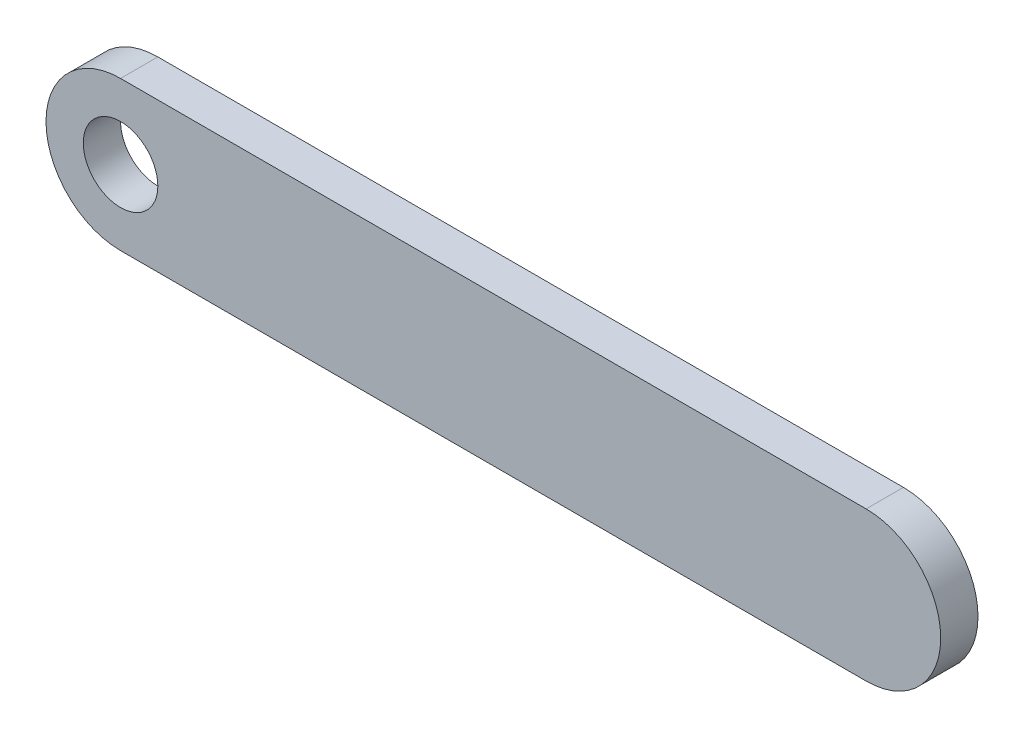
ISO-10303-21;
HEADER;
FILE_DESCRIPTION(('STEP AP214'),'2;1');
FILE_NAME('part.step','',(''),(''),'','','');
FILE_SCHEMA(('AUTOMOTIVE_DESIGN { 1 0 10303 214 1 1 1 1 }'));
ENDSEC;
DATA;
#1=APPLICATION_CONTEXT('core data for automotive mechanical design processes');
#2=APPLICATION_PROTOCOL_DEFINITION('international standard','automotive_design',2000,#1);
#3=PRODUCT_CONTEXT('',#1,'mechanical');
#4=PRODUCT('Part','Part','',(#3));
#5=PRODUCT_RELATED_PRODUCT_CATEGORY('part','',(#4));
#6=PRODUCT_DEFINITION_FORMATION('','',#4);
#7=PRODUCT_DEFINITION_CONTEXT('part definition',#1,'design');
#8=PRODUCT_DEFINITION('design','',#6,#7);
#9=PRODUCT_DEFINITION_SHAPE('','',#8);
#10=(LENGTH_UNIT() NAMED_UNIT(*) SI_UNIT(.MILLI.,.METRE.));
#11=(NAMED_UNIT(*) PLANE_ANGLE_UNIT() SI_UNIT($,.RADIAN.));
#12=(NAMED_UNIT(*) SI_UNIT($,.STERADIAN.) SOLID_ANGLE_UNIT());
#13=UNCERTAINTY_MEASURE_WITH_UNIT(LENGTH_MEASURE(1.E-05),#10,'distance_accuracy_value','');
#14=(GEOMETRIC_REPRESENTATION_CONTEXT(3) GLOBAL_UNCERTAINTY_ASSIGNED_CONTEXT((#13)) GLOBAL_UNIT_ASSIGNED_CONTEXT((#10,
#11,#12)) REPRESENTATION_CONTEXT('',''));
#15=CARTESIAN_POINT('',(0.,0.,0.));
#16=DIRECTION('',(0.,0.,1.));
#17=DIRECTION('',(1.,0.,0.));
#18=AXIS2_PLACEMENT_3D('',#15,#16,#17);
#19=CARTESIAN_POINT('',(0.,0.,5.));
#20=DIRECTION('',(0.,0.,1.));
#21=DIRECTION('',(1.,0.,0.));
#22=AXIS2_PLACEMENT_3D('',#19,#20,#21);
#23=PLANE('',#22);
#24=CARTESIAN_POINT('',(0.,0.,5.));
#25=DIRECTION('',(0.,0.,1.));
#26=DIRECTION('',(1.,0.,0.));
#27=AXIS2_PLACEMENT_3D('',#24,#25,#26);
#28=CIRCLE('',#27,10.);
#29=CARTESIAN_POINT('',(0.,10.,5.));
#30=VERTEX_POINT('',#29);
#31=CARTESIAN_POINT('',(0.,-10.,5.));
#32=VERTEX_POINT('',#31);
#33=EDGE_CURVE('E85',#30,#32,#28,.T.);
#34=ORIENTED_EDGE('',*,*,#33,.T.);
#35=DIRECTION('',(1.,0.,0.));
#36=VECTOR('',#35,1.);
#37=CARTESIAN_POINT('',(0.,-10.,5.));
#38=LINE('',#37,#36);
#39=CARTESIAN_POINT('',(100.,-10.,5.));
#40=VERTEX_POINT('',#39);
#41=EDGE_CURVE('E80',#32,#40,#38,.T.);
#42=ORIENTED_EDGE('',*,*,#41,.T.);
#43=CARTESIAN_POINT('',(100.,0.,5.));
#44=DIRECTION('',(0.,0.,1.));
#45=DIRECTION('',(1.,0.,0.));
#46=AXIS2_PLACEMENT_3D('',#43,#44,#45);
#47=CIRCLE('',#46,10.);
#48=CARTESIAN_POINT('',(100.,10.,5.));
#49=VERTEX_POINT('',#48);
#50=EDGE_CURVE('E83',#40,#49,#47,.T.);
#51=ORIENTED_EDGE('',*,*,#50,.T.);
#52=DIRECTION('',(-1.,0.,0.));
#53=VECTOR('',#52,1.);
#54=CARTESIAN_POINT('',(0.,10.,5.));
#55=LINE('',#54,#53);
#56=EDGE_CURVE('E50',#49,#30,#55,.T.);
#57=ORIENTED_EDGE('',*,*,#56,.T.);
#58=EDGE_LOOP('',(#34,#42,#51,#57));
#59=FACE_BOUND('',#58,.T.);
#60=CARTESIAN_POINT('',(0.,0.,5.));
#61=DIRECTION('',(0.,0.,1.));
#62=DIRECTION('',(1.,0.,0.));
#63=AXIS2_PLACEMENT_3D('',#60,#61,#62);
#64=CIRCLE('',#63,5.);
#65=CARTESIAN_POINT('',(5.,0.,5.));
#66=VERTEX_POINT('',#65);
#67=EDGE_CURVE('E100',#66,#66,#64,.T.);
#68=ORIENTED_EDGE('',*,*,#67,.F.);
#69=EDGE_LOOP('',(#68));
#70=FACE_BOUND('',#69,.T.);
#71=ADVANCED_FACE('F33',(#59,#70),#23,.T.);
#72=CARTESIAN_POINT('',(0.,0.,0.));
#73=DIRECTION('',(0.,0.,1.));
#74=DIRECTION('',(1.,0.,0.));
#75=AXIS2_PLACEMENT_3D('',#72,#73,#74);
#76=PLANE('',#75);
#77=CARTESIAN_POINT('',(0.,0.,0.));
#78=DIRECTION('',(0.,0.,1.));
#79=DIRECTION('',(1.,0.,0.));
#80=AXIS2_PLACEMENT_3D('',#77,#78,#79);
#81=CIRCLE('',#80,10.);
#82=CARTESIAN_POINT('',(0.,10.,0.));
#83=VERTEX_POINT('',#82);
#84=CARTESIAN_POINT('',(0.,-10.,0.));
#85=VERTEX_POINT('',#84);
#86=EDGE_CURVE('E97',#83,#85,#81,.T.);
#87=ORIENTED_EDGE('',*,*,#86,.F.);
#88=DIRECTION('',(-1.,0.,0.));
#89=VECTOR('',#88,1.);
#90=CARTESIAN_POINT('',(0.,10.,0.));
#91=LINE('',#90,#89);
#92=CARTESIAN_POINT('',(100.,10.,0.));
#93=VERTEX_POINT('',#92);
#94=EDGE_CURVE('E73',#93,#83,#91,.T.);
#95=ORIENTED_EDGE('',*,*,#94,.F.);
#96=CARTESIAN_POINT('',(100.,0.,0.));
#97=DIRECTION('',(0.,0.,1.));
#98=DIRECTION('',(1.,0.,0.));
#99=AXIS2_PLACEMENT_3D('',#96,#97,#98);
#100=CIRCLE('',#99,10.);
#101=CARTESIAN_POINT('',(100.,-10.,0.));
#102=VERTEX_POINT('',#101);
#103=EDGE_CURVE('E67',#102,#93,#100,.T.);
#104=ORIENTED_EDGE('',*,*,#103,.F.);
#105=DIRECTION('',(1.,0.,0.));
#106=VECTOR('',#105,1.);
#107=CARTESIAN_POINT('',(0.,-10.,0.));
#108=LINE('',#107,#106);
#109=EDGE_CURVE('E89',#85,#102,#108,.T.);
#110=ORIENTED_EDGE('',*,*,#109,.F.);
#111=EDGE_LOOP('',(#87,#95,#104,#110));
#112=FACE_BOUND('',#111,.T.);
#113=CARTESIAN_POINT('',(0.,0.,0.));
#114=DIRECTION('',(0.,0.,1.));
#115=DIRECTION('',(1.,0.,0.));
#116=AXIS2_PLACEMENT_3D('',#113,#114,#115);
#117=CIRCLE('',#116,5.);
#118=CARTESIAN_POINT('',(5.,0.,0.));
#119=VERTEX_POINT('',#118);
#120=EDGE_CURVE('E112',#119,#119,#117,.T.);
#121=ORIENTED_EDGE('',*,*,#120,.T.);
#122=EDGE_LOOP('',(#121));
#123=FACE_BOUND('',#122,.T.);
#124=ADVANCED_FACE('F108',(#112,#123),#76,.F.);
#125=CARTESIAN_POINT('',(0.,0.,5.));
#126=DIRECTION('',(0.,0.,-1.));
#127=DIRECTION('',(-1.,0.,0.));
#128=AXIS2_PLACEMENT_3D('',#125,#126,#127);
#129=CYLINDRICAL_SURFACE('',#128,10.);
#130=ORIENTED_EDGE('',*,*,#86,.T.);
#131=DIRECTION('',(0.,0.,-1.));
#132=VECTOR('',#131,1.);
#133=CARTESIAN_POINT('',(0.,-10.,5.));
#134=LINE('',#133,#132);
#135=EDGE_CURVE('E11',#32,#85,#134,.T.);
#136=ORIENTED_EDGE('',*,*,#135,.F.);
#137=ORIENTED_EDGE('',*,*,#33,.F.);
#138=DIRECTION('',(0.,0.,-1.));
#139=VECTOR('',#138,1.);
#140=CARTESIAN_POINT('',(0.,10.,5.));
#141=LINE('',#140,#139);
#142=EDGE_CURVE('E93',#30,#83,#141,.T.);
#143=ORIENTED_EDGE('',*,*,#142,.T.);
#144=EDGE_LOOP('',(#130,#136,#137,#143));
#145=FACE_BOUND('',#144,.T.);
#146=ADVANCED_FACE('F35',(#145),#129,.T.);
#147=CARTESIAN_POINT('',(0.,-10.,5.));
#148=DIRECTION('',(0.,1.,0.));
#149=DIRECTION('',(0.,0.,1.));
#150=AXIS2_PLACEMENT_3D('',#147,#148,#149);
#151=PLANE('',#150);
#152=ORIENTED_EDGE('',*,*,#109,.T.);
#153=DIRECTION('',(0.,0.,-1.));
#154=VECTOR('',#153,1.);
#155=CARTESIAN_POINT('',(100.,-10.,5.));
#156=LINE('',#155,#154);
#157=EDGE_CURVE('E42',#40,#102,#156,.T.);
#158=ORIENTED_EDGE('',*,*,#157,.F.);
#159=ORIENTED_EDGE('',*,*,#41,.F.);
#160=ORIENTED_EDGE('',*,*,#135,.T.);
#161=EDGE_LOOP('',(#152,#158,#159,#160));
#162=FACE_BOUND('',#161,.T.);
#163=ADVANCED_FACE('F88',(#162),#151,.F.);
#164=CARTESIAN_POINT('',(100.,0.,5.));
#165=DIRECTION('',(0.,0.,-1.));
#166=DIRECTION('',(-1.,0.,0.));
#167=AXIS2_PLACEMENT_3D('',#164,#165,#166);
#168=CYLINDRICAL_SURFACE('',#167,10.);
#169=ORIENTED_EDGE('',*,*,#103,.T.);
#170=DIRECTION('',(0.,0.,-1.));
#171=VECTOR('',#170,1.);
#172=CARTESIAN_POINT('',(100.,10.,5.));
#173=LINE('',#172,#171);
#174=EDGE_CURVE('E90',#49,#93,#173,.T.);
#175=ORIENTED_EDGE('',*,*,#174,.F.);
#176=ORIENTED_EDGE('',*,*,#50,.F.);
#177=ORIENTED_EDGE('',*,*,#157,.T.);
#178=EDGE_LOOP('',(#169,#175,#176,#177));
#179=FACE_BOUND('',#178,.T.);
#180=ADVANCED_FACE('F91',(#179),#168,.T.);
#181=CARTESIAN_POINT('',(0.,10.,5.));
#182=DIRECTION('',(0.,-1.,0.));
#183=DIRECTION('',(0.,0.,-1.));
#184=AXIS2_PLACEMENT_3D('',#181,#182,#183);
#185=PLANE('',#184);
#186=ORIENTED_EDGE('',*,*,#94,.T.);
#187=ORIENTED_EDGE('',*,*,#142,.F.);
#188=ORIENTED_EDGE('',*,*,#56,.F.);
#189=ORIENTED_EDGE('',*,*,#174,.T.);
#190=EDGE_LOOP('',(#186,#187,#188,#189));
#191=FACE_BOUND('',#190,.T.);
#192=ADVANCED_FACE('F105',(#191),#185,.F.);
#193=CARTESIAN_POINT('',(0.,0.,5.));
#194=DIRECTION('',(0.,0.,-1.));
#195=DIRECTION('',(-1.,0.,0.));
#196=AXIS2_PLACEMENT_3D('',#193,#194,#195);
#197=CYLINDRICAL_SURFACE('',#196,5.);
#198=ORIENTED_EDGE('',*,*,#67,.T.);
#199=EDGE_LOOP('',(#198));
#200=FACE_BOUND('',#199,.T.);
#201=ORIENTED_EDGE('',*,*,#120,.F.);
#202=EDGE_LOOP('',(#201));
#203=FACE_BOUND('',#202,.T.);
#204=ADVANCED_FACE('F118',(#200,#203),#197,.F.);
#205=CLOSED_SHELL('',(#71,#124,#146,#163,#180,#192,#204));
#206=MANIFOLD_SOLID_BREP('B2',#205);
#207=ADVANCED_BREP_SHAPE_REPRESENTATION('',(#18,#206),#14);
#208=SHAPE_DEFINITION_REPRESENTATION(#9,#207);
ENDSEC;
END-ISO-10303-21;
